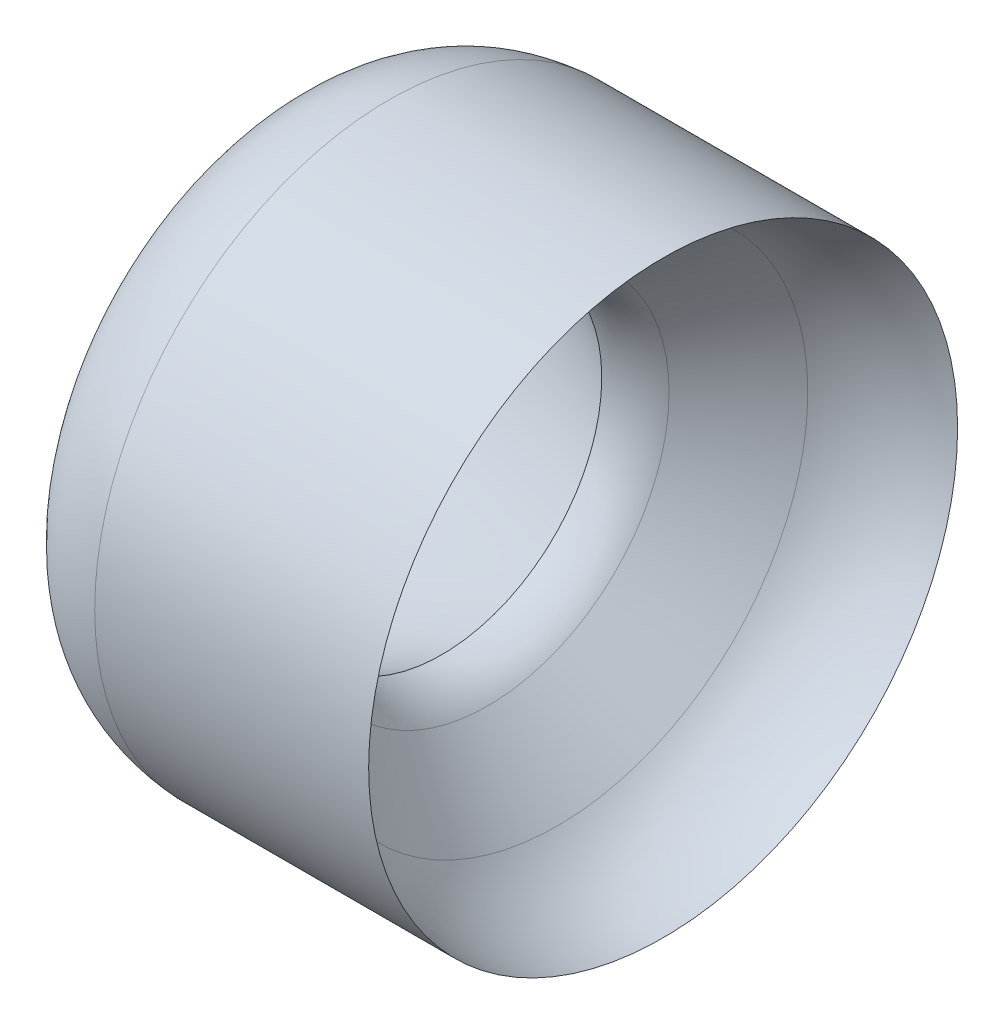
ISO-10303-21;
HEADER;
FILE_DESCRIPTION(('STEP AP214'),'2;1');
FILE_NAME('part.step','',(''),(''),'','','');
FILE_SCHEMA(('AUTOMOTIVE_DESIGN { 1 0 10303 214 1 1 1 1 }'));
ENDSEC;
DATA;
#1=APPLICATION_CONTEXT('core data for automotive mechanical design processes');
#2=APPLICATION_PROTOCOL_DEFINITION('international standard','automotive_design',2000,#1);
#3=PRODUCT_CONTEXT('',#1,'mechanical');
#4=PRODUCT('Part','Part','',(#3));
#5=PRODUCT_RELATED_PRODUCT_CATEGORY('part','',(#4));
#6=PRODUCT_DEFINITION_FORMATION('','',#4);
#7=PRODUCT_DEFINITION_CONTEXT('part definition',#1,'design');
#8=PRODUCT_DEFINITION('design','',#6,#7);
#9=PRODUCT_DEFINITION_SHAPE('','',#8);
#10=(LENGTH_UNIT() NAMED_UNIT(*) SI_UNIT(.MILLI.,.METRE.));
#11=(NAMED_UNIT(*) PLANE_ANGLE_UNIT() SI_UNIT($,.RADIAN.));
#12=(NAMED_UNIT(*) SI_UNIT($,.STERADIAN.) SOLID_ANGLE_UNIT());
#13=UNCERTAINTY_MEASURE_WITH_UNIT(LENGTH_MEASURE(1.E-05),#10,'distance_accuracy_value','');
#14=(GEOMETRIC_REPRESENTATION_CONTEXT(3) GLOBAL_UNCERTAINTY_ASSIGNED_CONTEXT((#13)) GLOBAL_UNIT_ASSIGNED_CONTEXT((#10,
#11,#12)) REPRESENTATION_CONTEXT('',''));
#15=CARTESIAN_POINT('',(0.,0.,0.));
#16=DIRECTION('',(0.,0.,1.));
#17=DIRECTION('',(1.,0.,0.));
#18=AXIS2_PLACEMENT_3D('',#15,#16,#17);
#19=CARTESIAN_POINT('',(28.9492369333014,0.,0.));
#20=DIRECTION('',(-1.,0.,0.));
#21=DIRECTION('',(0.,0.,1.));
#22=AXIS2_PLACEMENT_3D('',#19,#20,#21);
#23=DEGENERATE_TOROIDAL_SURFACE('',#22,17.3860040166505,18.,.T.);
#24=CARTESIAN_POINT('',(28.9492369333014,0.,0.));
#25=DIRECTION('',(-1.,0.,0.));
#26=DIRECTION('',(0.,0.,1.));
#27=AXIS2_PLACEMENT_3D('',#24,#25,#26);
#28=CIRCLE('',#27,35.3860040166505);
#29=CARTESIAN_POINT('',(28.9492369333014,0.,35.3860040166505));
#30=VERTEX_POINT('',#29);
#31=EDGE_CURVE('E10',#30,#30,#28,.T.);
#32=ORIENTED_EDGE('',*,*,#31,.F.);
#33=EDGE_LOOP('',(#32));
#34=FACE_BOUND('',#33,.T.);
#35=CARTESIAN_POINT('',(16.2213148719435,0.,0.));
#36=DIRECTION('',(-1.,0.,0.));
#37=DIRECTION('',(0.,0.,1.));
#38=AXIS2_PLACEMENT_3D('',#35,#36,#37);
#39=CIRCLE('',#38,30.1139260780083);
#40=CARTESIAN_POINT('',(16.2213148719435,0.,30.1139260780083));
#41=VERTEX_POINT('',#40);
#42=EDGE_CURVE('E61',#41,#41,#39,.T.);
#43=ORIENTED_EDGE('',*,*,#42,.T.);
#44=EDGE_LOOP('',(#43));
#45=FACE_BOUND('',#44,.T.);
#46=ADVANCED_FACE('F39',(#34,#45),#23,.F.);
#47=CARTESIAN_POINT('',(-206.148150746514,0.,0.));
#48=DIRECTION('',(-1.,0.,0.));
#49=DIRECTION('',(0.,0.,1.));
#50=AXIS2_PLACEMENT_3D('',#47,#48,#49);
#51=CYLINDRICAL_SURFACE('',#50,35.3860040166505);
#52=CARTESIAN_POINT('',(-3.96962367742146,0.,0.));
#53=DIRECTION('',(-1.,0.,0.));
#54=DIRECTION('',(0.,0.,1.));
#55=AXIS2_PLACEMENT_3D('',#52,#53,#54);
#56=CIRCLE('',#55,35.3860040166505);
#57=CARTESIAN_POINT('',(-3.96962367742146,0.,35.3860040166505));
#58=VERTEX_POINT('',#57);
#59=EDGE_CURVE('E45',#58,#58,#56,.T.);
#60=ORIENTED_EDGE('',*,*,#59,.F.);
#61=EDGE_LOOP('',(#60));
#62=FACE_BOUND('',#61,.T.);
#63=ORIENTED_EDGE('',*,*,#31,.T.);
#64=EDGE_LOOP('',(#63));
#65=FACE_BOUND('',#64,.T.);
#66=ADVANCED_FACE('F84',(#62,#65),#51,.T.);
#67=CARTESIAN_POINT('',(-3.96962367742146,35.3860040166505,0.));
#68=CARTESIAN_POINT('',(-13.7606946781878,34.6245611965824,0.));
#69=CARTESIAN_POINT('',(-16.967528587351,26.4407453973612,0.));
#70=B_SPLINE_CURVE_WITH_KNOTS('',2,(#67,#68,#69),.UNSPECIFIED.,.F.,.F.,(3,3),(0.,1.),.UNSPECIFIED.);
#71=CARTESIAN_POINT('',(-206.148150746514,0.,0.));
#72=DIRECTION('',(-1.,0.,0.));
#73=AXIS1_PLACEMENT('',#71,#72);
#74=SURFACE_OF_REVOLUTION('',#70,#73);
#75=CARTESIAN_POINT('',(-16.967528587351,0.,0.));
#76=DIRECTION('',(-1.,0.,0.));
#77=DIRECTION('',(0.,0.,1.));
#78=AXIS2_PLACEMENT_3D('',#75,#76,#77);
#79=CIRCLE('',#78,26.4407453973612);
#80=CARTESIAN_POINT('',(-16.967528587351,0.,26.4407453973612));
#81=VERTEX_POINT('',#80);
#82=EDGE_CURVE('E49',#81,#81,#79,.T.);
#83=ORIENTED_EDGE('',*,*,#82,.F.);
#84=EDGE_LOOP('',(#83));
#85=FACE_BOUND('',#84,.T.);
#86=ORIENTED_EDGE('',*,*,#59,.T.);
#87=EDGE_LOOP('',(#86));
#88=FACE_BOUND('',#87,.T.);
#89=ADVANCED_FACE('F80',(#85,#88),#74,.T.);
#90=CARTESIAN_POINT('',(-106194.840613146,-994551.760349036,0.));
#91=CARTESIAN_POINT('',(84439.8344169674,996460.24577104,0.));
#92=CARTESIAN_POINT('',(-62973.1699501058,-998217.621450031,0.));
#93=B_SPLINE_CURVE_WITH_KNOTS('',2,(#90,#91,#92),.UNSPECIFIED.,.F.,.F.,(3,3),(0.,1.),.UNSPECIFIED.);
#94=CARTESIAN_POINT('',(-206.148150746514,0.,0.));
#95=DIRECTION('',(-1.,0.,0.));
#96=AXIS1_PLACEMENT('',#94,#95);
#97=SURFACE_OF_REVOLUTION('',#93,#96);
#98=CARTESIAN_POINT('',(2.34818468875808,0.,0.));
#99=DIRECTION('',(-1.,0.,0.));
#100=DIRECTION('',(0.,0.,1.));
#101=AXIS2_PLACEMENT_3D('',#98,#99,#100);
#102=CIRCLE('',#101,19.2267693933648);
#103=CARTESIAN_POINT('',(2.34818468875808,0.,19.2267693933648));
#104=VERTEX_POINT('',#103);
#105=EDGE_CURVE('E53',#104,#104,#102,.T.);
#106=ORIENTED_EDGE('',*,*,#105,.F.);
#107=EDGE_LOOP('',(#106));
#108=FACE_BOUND('',#107,.T.);
#109=ORIENTED_EDGE('',*,*,#82,.T.);
#110=EDGE_LOOP('',(#109));
#111=FACE_BOUND('',#110,.T.);
#112=ADVANCED_FACE('F75',(#108,#111),#97,.T.);
#113=CARTESIAN_POINT('',(1.66230944505193,0.,0.));
#114=DIRECTION('',(-1.,0.,0.));
#115=DIRECTION('',(0.,0.,1.));
#116=AXIS2_PLACEMENT_3D('',#113,#114,#115);
#117=TOROIDAL_SURFACE('',#116,28.,8.80000000000001);
#118=CARTESIAN_POINT('',(7.88484911949355,0.,0.));
#119=DIRECTION('',(-1.,0.,0.));
#120=DIRECTION('',(0.,0.,1.));
#121=AXIS2_PLACEMENT_3D('',#118,#119,#120);
#122=CIRCLE('',#121,21.7774603255584);
#123=CARTESIAN_POINT('',(7.88484911949355,0.,21.7774603255584));
#124=VERTEX_POINT('',#123);
#125=EDGE_CURVE('E58',#124,#124,#122,.T.);
#126=ORIENTED_EDGE('',*,*,#125,.F.);
#127=EDGE_LOOP('',(#126));
#128=FACE_BOUND('',#127,.T.);
#129=ORIENTED_EDGE('',*,*,#105,.T.);
#130=EDGE_LOOP('',(#129));
#131=FACE_BOUND('',#130,.T.);
#132=ADVANCED_FACE('F79',(#128,#131),#117,.T.);
#133=CARTESIAN_POINT('',(7.88484911949355,0.,0.));
#134=DIRECTION('',(1.,0.,0.));
#135=DIRECTION('',(0.,0.,-1.));
#136=AXIS2_PLACEMENT_3D('',#133,#134,#135);
#137=CONICAL_SURFACE('',#136,21.7774603255584,0.78539816339745);
#138=ORIENTED_EDGE('',*,*,#42,.F.);
#139=EDGE_LOOP('',(#138));
#140=FACE_BOUND('',#139,.T.);
#141=ORIENTED_EDGE('',*,*,#125,.T.);
#142=EDGE_LOOP('',(#141));
#143=FACE_BOUND('',#142,.T.);
#144=ADVANCED_FACE('F97',(#140,#143),#137,.F.);
#145=CLOSED_SHELL('',(#46,#66,#89,#112,#132,#144));
#146=MANIFOLD_SOLID_BREP('B2',#145);
#147=ADVANCED_BREP_SHAPE_REPRESENTATION('',(#18,#146),#14);
#148=SHAPE_DEFINITION_REPRESENTATION(#9,#147);
ENDSEC;
END-ISO-10303-21;
